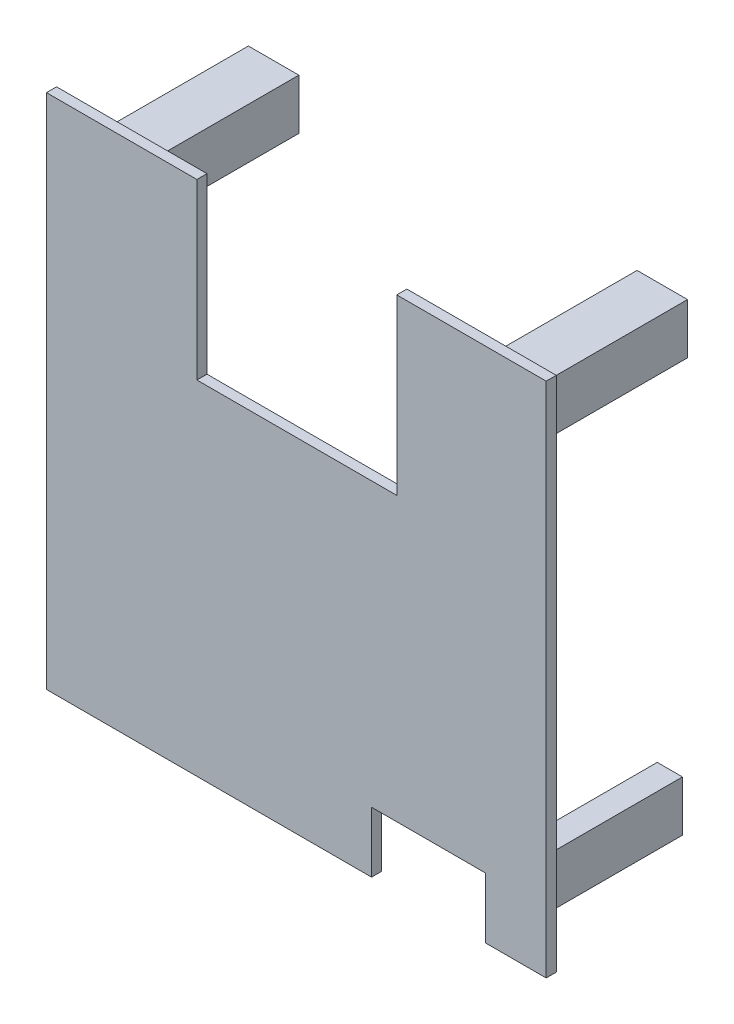
ISO-10303-21;
HEADER;
FILE_DESCRIPTION(('STEP AP214'),'2;1');
FILE_NAME('part.step','',(''),(''),'','','');
FILE_SCHEMA(('AUTOMOTIVE_DESIGN { 1 0 10303 214 1 1 1 1 }'));
ENDSEC;
DATA;
#1=APPLICATION_CONTEXT('core data for automotive mechanical design processes');
#2=APPLICATION_PROTOCOL_DEFINITION('international standard','automotive_design',2000,#1);
#3=PRODUCT_CONTEXT('',#1,'mechanical');
#4=PRODUCT('Part','Part','',(#3));
#5=PRODUCT_RELATED_PRODUCT_CATEGORY('part','',(#4));
#6=PRODUCT_DEFINITION_FORMATION('','',#4);
#7=PRODUCT_DEFINITION_CONTEXT('part definition',#1,'design');
#8=PRODUCT_DEFINITION('design','',#6,#7);
#9=PRODUCT_DEFINITION_SHAPE('','',#8);
#10=(LENGTH_UNIT() NAMED_UNIT(*) SI_UNIT(.MILLI.,.METRE.));
#11=(NAMED_UNIT(*) PLANE_ANGLE_UNIT() SI_UNIT($,.RADIAN.));
#12=(NAMED_UNIT(*) SI_UNIT($,.STERADIAN.) SOLID_ANGLE_UNIT());
#13=UNCERTAINTY_MEASURE_WITH_UNIT(LENGTH_MEASURE(1.E-05),#10,'distance_accuracy_value','');
#14=(GEOMETRIC_REPRESENTATION_CONTEXT(3) GLOBAL_UNCERTAINTY_ASSIGNED_CONTEXT((#13)) GLOBAL_UNIT_ASSIGNED_CONTEXT((#10,
#11,#12)) REPRESENTATION_CONTEXT('',''));
#15=CARTESIAN_POINT('',(0.,0.,0.));
#16=DIRECTION('',(0.,0.,1.));
#17=DIRECTION('',(1.,0.,0.));
#18=AXIS2_PLACEMENT_3D('',#15,#16,#17);
#19=CARTESIAN_POINT('',(0.,0.,0.));
#20=DIRECTION('',(0.,0.,1.));
#21=DIRECTION('',(1.,0.,0.));
#22=AXIS2_PLACEMENT_3D('',#19,#20,#21);
#23=PLANE('',#22);
#24=DIRECTION('',(0.,-1.,0.));
#25=VECTOR('',#24,1.);
#26=CARTESIAN_POINT('',(20.3831367483599,13.5887096774194,0.));
#27=LINE('',#26,#25);
#28=CARTESIAN_POINT('',(20.3831367483599,13.5887096774194,0.));
#29=VERTEX_POINT('',#28);
#30=CARTESIAN_POINT('',(20.3831367483599,8.58870967741935,0.));
#31=VERTEX_POINT('',#30);
#32=EDGE_CURVE('E257',#29,#31,#27,.T.);
#33=ORIENTED_EDGE('',*,*,#32,.F.);
#34=DIRECTION('',(1.,0.,0.));
#35=VECTOR('',#34,1.);
#36=CARTESIAN_POINT('',(20.3831367483599,13.5887096774194,0.));
#37=LINE('',#36,#35);
#38=CARTESIAN_POINT('',(15.3831367483599,13.5887096774194,0.));
#39=VERTEX_POINT('',#38);
#40=EDGE_CURVE('E273',#39,#29,#37,.T.);
#41=ORIENTED_EDGE('',*,*,#40,.F.);
#42=DIRECTION('',(0.,1.,0.));
#43=VECTOR('',#42,1.);
#44=CARTESIAN_POINT('',(15.3831367483599,13.5887096774194,0.));
#45=LINE('',#44,#43);
#46=CARTESIAN_POINT('',(15.3831367483599,8.58870967741935,0.));
#47=VERTEX_POINT('',#46);
#48=EDGE_CURVE('E286',#47,#39,#45,.T.);
#49=ORIENTED_EDGE('',*,*,#48,.F.);
#50=DIRECTION('',(-1.,0.,0.));
#51=VECTOR('',#50,1.);
#52=CARTESIAN_POINT('',(20.3831367483599,8.58870967741935,0.));
#53=LINE('',#52,#51);
#54=EDGE_CURVE('E262',#31,#47,#53,.T.);
#55=ORIENTED_EDGE('',*,*,#54,.F.);
#56=EDGE_LOOP('',(#33,#41,#49,#55));
#57=FACE_BOUND('',#56,.T.);
#58=DIRECTION('',(0.,-1.,0.));
#59=VECTOR('',#58,1.);
#60=CARTESIAN_POINT('',(-18.1168632516401,13.5887096774194,0.));
#61=LINE('',#60,#59);
#62=CARTESIAN_POINT('',(-18.1168632516401,13.5887096774194,0.));
#63=VERTEX_POINT('',#62);
#64=CARTESIAN_POINT('',(-18.1168632516401,8.58870967741935,0.));
#65=VERTEX_POINT('',#64);
#66=EDGE_CURVE('E353',#63,#65,#61,.T.);
#67=ORIENTED_EDGE('',*,*,#66,.F.);
#68=DIRECTION('',(1.,0.,0.));
#69=VECTOR('',#68,1.);
#70=CARTESIAN_POINT('',(-18.1168632516401,13.5887096774194,0.));
#71=LINE('',#70,#69);
#72=CARTESIAN_POINT('',(-23.1168632516401,13.5887096774194,0.));
#73=VERTEX_POINT('',#72);
#74=EDGE_CURVE('E359',#73,#63,#71,.T.);
#75=ORIENTED_EDGE('',*,*,#74,.F.);
#76=DIRECTION('',(0.,1.,0.));
#77=VECTOR('',#76,1.);
#78=CARTESIAN_POINT('',(-23.1168632516401,13.5887096774194,0.));
#79=LINE('',#78,#77);
#80=CARTESIAN_POINT('',(-23.1168632516401,8.58870967741935,0.));
#81=VERTEX_POINT('',#80);
#82=EDGE_CURVE('E376',#81,#73,#79,.T.);
#83=ORIENTED_EDGE('',*,*,#82,.F.);
#84=DIRECTION('',(-1.,0.,0.));
#85=VECTOR('',#84,1.);
#86=CARTESIAN_POINT('',(-18.1168632516401,8.58870967741935,0.));
#87=LINE('',#86,#85);
#88=EDGE_CURVE('E372',#65,#81,#87,.T.);
#89=ORIENTED_EDGE('',*,*,#88,.F.);
#90=EDGE_LOOP('',(#67,#75,#83,#89));
#91=FACE_BOUND('',#90,.T.);
#92=DIRECTION('',(-1.,0.,0.));
#93=VECTOR('',#92,1.);
#94=CARTESIAN_POINT('',(19.8831367483599,-32.6112903225806,0.));
#95=LINE('',#94,#93);
#96=CARTESIAN_POINT('',(19.8831367483599,-32.6112903225806,0.));
#97=VERTEX_POINT('',#96);
#98=CARTESIAN_POINT('',(17.3831367483599,-32.6112903225806,0.));
#99=VERTEX_POINT('',#98);
#100=EDGE_CURVE('E327',#97,#99,#95,.T.);
#101=ORIENTED_EDGE('',*,*,#100,.F.);
#102=DIRECTION('',(0.,-1.,0.));
#103=VECTOR('',#102,1.);
#104=CARTESIAN_POINT('',(19.8831367483599,-27.6112903225806,0.));
#105=LINE('',#104,#103);
#106=CARTESIAN_POINT('',(19.8831367483599,-27.6112903225806,0.));
#107=VERTEX_POINT('',#106);
#108=EDGE_CURVE('E308',#107,#97,#105,.T.);
#109=ORIENTED_EDGE('',*,*,#108,.F.);
#110=DIRECTION('',(1.,0.,0.));
#111=VECTOR('',#110,1.);
#112=CARTESIAN_POINT('',(19.8831367483599,-27.6112903225806,0.));
#113=LINE('',#112,#111);
#114=CARTESIAN_POINT('',(17.3831367483599,-27.6112903225806,0.));
#115=VERTEX_POINT('',#114);
#116=EDGE_CURVE('E314',#115,#107,#113,.T.);
#117=ORIENTED_EDGE('',*,*,#116,.F.);
#118=DIRECTION('',(0.,1.,0.));
#119=VECTOR('',#118,1.);
#120=CARTESIAN_POINT('',(17.3831367483599,-27.6112903225806,0.));
#121=LINE('',#120,#119);
#122=CARTESIAN_POINT('',(17.3831367483599,-28.6112903225806,0.));
#123=VERTEX_POINT('',#122);
#124=EDGE_CURVE('E331',#123,#115,#121,.T.);
#125=ORIENTED_EDGE('',*,*,#124,.F.);
#126=DIRECTION('',(-1.,0.,0.));
#127=VECTOR('',#126,1.);
#128=CARTESIAN_POINT('',(0.,-28.6112903225807,0.));
#129=LINE('',#128,#127);
#130=CARTESIAN_POINT('',(6.0831367483599,-28.6112903225807,0.));
#131=VERTEX_POINT('',#130);
#132=EDGE_CURVE('E496',#123,#131,#129,.T.);
#133=ORIENTED_EDGE('',*,*,#132,.T.);
#134=DIRECTION('',(0.,-1.,0.));
#135=VECTOR('',#134,1.);
#136=CARTESIAN_POINT('',(6.08313674835987,0.,0.));
#137=LINE('',#136,#135);
#138=CARTESIAN_POINT('',(6.08313674835991,-34.6112903225806,0.));
#139=VERTEX_POINT('',#138);
#140=EDGE_CURVE('E500',#131,#139,#137,.T.);
#141=ORIENTED_EDGE('',*,*,#140,.T.);
#142=DIRECTION('',(1.,0.,0.));
#143=VECTOR('',#142,1.);
#144=CARTESIAN_POINT('',(-26.1168632516401,-34.6112903225806,0.));
#145=LINE('',#144,#143);
#146=CARTESIAN_POINT('',(-26.1168632516401,-34.6112903225806,0.));
#147=VERTEX_POINT('',#146);
#148=EDGE_CURVE('E470',#147,#139,#145,.T.);
#149=ORIENTED_EDGE('',*,*,#148,.F.);
#150=DIRECTION('',(0.,-1.,0.));
#151=VECTOR('',#150,1.);
#152=CARTESIAN_POINT('',(-26.1168632516401,16.5887096774194,0.));
#153=LINE('',#152,#151);
#154=CARTESIAN_POINT('',(-26.1168632516401,16.5887096774194,0.));
#155=VERTEX_POINT('',#154);
#156=EDGE_CURVE('E415',#155,#147,#153,.T.);
#157=ORIENTED_EDGE('',*,*,#156,.F.);
#158=DIRECTION('',(-1.,0.,0.));
#159=VECTOR('',#158,1.);
#160=CARTESIAN_POINT('',(-26.1168632516401,16.5887096774194,0.));
#161=LINE('',#160,#159);
#162=CARTESIAN_POINT('',(-11.2168632516401,16.5887096774194,0.));
#163=VERTEX_POINT('',#162);
#164=EDGE_CURVE('E477',#163,#155,#161,.T.);
#165=ORIENTED_EDGE('',*,*,#164,.F.);
#166=DIRECTION('',(0.,-1.,0.));
#167=VECTOR('',#166,1.);
#168=CARTESIAN_POINT('',(-11.2168632516401,0.,0.));
#169=LINE('',#168,#167);
#170=CARTESIAN_POINT('',(-11.2168632516401,-0.611290322580643,0.));
#171=VERTEX_POINT('',#170);
#172=EDGE_CURVE('E11',#163,#171,#169,.T.);
#173=ORIENTED_EDGE('',*,*,#172,.T.);
#174=DIRECTION('',(1.,0.,0.));
#175=VECTOR('',#174,1.);
#176=CARTESIAN_POINT('',(0.,-0.611290322580643,0.));
#177=LINE('',#176,#175);
#178=CARTESIAN_POINT('',(8.58313674835991,-0.611290322580643,0.));
#179=VERTEX_POINT('',#178);
#180=EDGE_CURVE('E507',#171,#179,#177,.T.);
#181=ORIENTED_EDGE('',*,*,#180,.T.);
#182=DIRECTION('',(0.,1.,0.));
#183=VECTOR('',#182,1.);
#184=CARTESIAN_POINT('',(8.58313674835991,0.,0.));
#185=LINE('',#184,#183);
#186=CARTESIAN_POINT('',(8.5831367483599,16.5887096774194,0.));
#187=VERTEX_POINT('',#186);
#188=EDGE_CURVE('E56',#179,#187,#185,.T.);
#189=ORIENTED_EDGE('',*,*,#188,.T.);
#190=CARTESIAN_POINT('',(23.3831367483599,16.5887096774194,0.));
#191=VERTEX_POINT('',#190);
#192=EDGE_CURVE('E452',#191,#187,#161,.T.);
#193=ORIENTED_EDGE('',*,*,#192,.F.);
#194=DIRECTION('',(0.,1.,0.));
#195=VECTOR('',#194,1.);
#196=CARTESIAN_POINT('',(23.3831367483599,16.5887096774194,0.));
#197=LINE('',#196,#195);
#198=CARTESIAN_POINT('',(23.3831367483599,-34.6112903225806,0.));
#199=VERTEX_POINT('',#198);
#200=EDGE_CURVE('E474',#199,#191,#197,.T.);
#201=ORIENTED_EDGE('',*,*,#200,.F.);
#202=CARTESIAN_POINT('',(17.3831367483599,-34.6112903225806,0.));
#203=VERTEX_POINT('',#202);
#204=EDGE_CURVE('E469',#203,#199,#145,.T.);
#205=ORIENTED_EDGE('',*,*,#204,.F.);
#206=DIRECTION('',(0.,1.,0.));
#207=VECTOR('',#206,1.);
#208=CARTESIAN_POINT('',(17.3831367483599,0.,0.));
#209=LINE('',#208,#207);
#210=EDGE_CURVE('E504',#203,#99,#209,.T.);
#211=ORIENTED_EDGE('',*,*,#210,.T.);
#212=EDGE_LOOP('',(#101,#109,#117,#125,#133,#141,#149,#157,#165,#173,#181,#189,#193,#201,#205,#211));
#213=FACE_BOUND('',#212,.T.);
#214=DIRECTION('',(0.,-1.,0.));
#215=VECTOR('',#214,1.);
#216=CARTESIAN_POINT('',(-19.1168632516401,-27.6112903225806,0.));
#217=LINE('',#216,#215);
#218=CARTESIAN_POINT('',(-19.1168632516401,-27.6112903225806,0.));
#219=VERTEX_POINT('',#218);
#220=CARTESIAN_POINT('',(-19.1168632516401,-31.6112903225806,0.));
#221=VERTEX_POINT('',#220);
#222=EDGE_CURVE('E255',#219,#221,#217,.T.);
#223=ORIENTED_EDGE('',*,*,#222,.F.);
#224=DIRECTION('',(1.,0.,0.));
#225=VECTOR('',#224,1.);
#226=CARTESIAN_POINT('',(-19.1168632516401,-27.6112903225806,0.));
#227=LINE('',#226,#225);
#228=CARTESIAN_POINT('',(-23.1168632516401,-27.6112903225806,0.));
#229=VERTEX_POINT('',#228);
#230=EDGE_CURVE('E252',#229,#219,#227,.T.);
#231=ORIENTED_EDGE('',*,*,#230,.F.);
#232=DIRECTION('',(0.,1.,0.));
#233=VECTOR('',#232,1.);
#234=CARTESIAN_POINT('',(-23.1168632516401,-27.6112903225806,0.));
#235=LINE('',#234,#233);
#236=CARTESIAN_POINT('',(-23.1168632516401,-31.6112903225806,0.));
#237=VERTEX_POINT('',#236);
#238=EDGE_CURVE('E68',#237,#229,#235,.T.);
#239=ORIENTED_EDGE('',*,*,#238,.F.);
#240=DIRECTION('',(-1.,0.,0.));
#241=VECTOR('',#240,1.);
#242=CARTESIAN_POINT('',(-19.1168632516401,-31.6112903225806,0.));
#243=LINE('',#242,#241);
#244=EDGE_CURVE('E63',#221,#237,#243,.T.);
#245=ORIENTED_EDGE('',*,*,#244,.F.);
#246=EDGE_LOOP('',(#223,#231,#239,#245));
#247=FACE_BOUND('',#246,.T.);
#248=ADVANCED_FACE('F47',(#57,#91,#213,#247),#23,.F.);
#249=CARTESIAN_POINT('',(-26.1168632516401,-34.6112903225806,1.));
#250=DIRECTION('',(0.,1.,0.));
#251=DIRECTION('',(0.,0.,1.));
#252=AXIS2_PLACEMENT_3D('',#249,#250,#251);
#253=PLANE('',#252);
#254=DIRECTION('',(1.,0.,0.));
#255=VECTOR('',#254,1.);
#256=CARTESIAN_POINT('',(-26.1168632516401,-34.6112903225806,1.));
#257=LINE('',#256,#255);
#258=CARTESIAN_POINT('',(17.3831367483599,-34.6112903225806,1.));
#259=VERTEX_POINT('',#258);
#260=CARTESIAN_POINT('',(23.3831367483599,-34.6112903225806,1.));
#261=VERTEX_POINT('',#260);
#262=EDGE_CURVE('E451',#259,#261,#257,.T.);
#263=ORIENTED_EDGE('',*,*,#262,.F.);
#264=DIRECTION('',(0.,0.,1.));
#265=VECTOR('',#264,1.);
#266=CARTESIAN_POINT('',(17.3831367483599,-34.6112903225806,-4.));
#267=LINE('',#266,#265);
#268=EDGE_CURVE('E398',#203,#259,#267,.T.);
#269=ORIENTED_EDGE('',*,*,#268,.F.);
#270=ORIENTED_EDGE('',*,*,#204,.T.);
#271=DIRECTION('',(0.,0.,-1.));
#272=VECTOR('',#271,1.);
#273=CARTESIAN_POINT('',(23.3831367483599,-34.6112903225806,1.));
#274=LINE('',#273,#272);
#275=EDGE_CURVE('E488',#261,#199,#274,.T.);
#276=ORIENTED_EDGE('',*,*,#275,.F.);
#277=EDGE_LOOP('',(#263,#269,#270,#276));
#278=FACE_BOUND('',#277,.T.);
#279=ADVANCED_FACE('F561',(#278),#253,.F.);
#280=CARTESIAN_POINT('',(-26.1168632516401,16.5887096774194,1.));
#281=DIRECTION('',(0.,-1.,0.));
#282=DIRECTION('',(0.,0.,-1.));
#283=AXIS2_PLACEMENT_3D('',#280,#281,#282);
#284=PLANE('',#283);
#285=DIRECTION('',(-1.,0.,0.));
#286=VECTOR('',#285,1.);
#287=CARTESIAN_POINT('',(-26.1168632516401,16.5887096774194,1.));
#288=LINE('',#287,#286);
#289=CARTESIAN_POINT('',(-11.2168632516401,16.5887096774194,1.));
#290=VERTEX_POINT('',#289);
#291=CARTESIAN_POINT('',(-26.1168632516401,16.5887096774194,1.));
#292=VERTEX_POINT('',#291);
#293=EDGE_CURVE('E460',#290,#292,#288,.T.);
#294=ORIENTED_EDGE('',*,*,#293,.F.);
#295=DIRECTION('',(0.,0.,1.));
#296=VECTOR('',#295,1.);
#297=CARTESIAN_POINT('',(-11.2168632516401,16.5887096774194,-4.));
#298=LINE('',#297,#296);
#299=EDGE_CURVE('E412',#163,#290,#298,.T.);
#300=ORIENTED_EDGE('',*,*,#299,.F.);
#301=ORIENTED_EDGE('',*,*,#164,.T.);
#302=DIRECTION('',(0.,0.,-1.));
#303=VECTOR('',#302,1.);
#304=CARTESIAN_POINT('',(-26.1168632516401,16.5887096774194,1.));
#305=LINE('',#304,#303);
#306=EDGE_CURVE('E465',#292,#155,#305,.T.);
#307=ORIENTED_EDGE('',*,*,#306,.F.);
#308=EDGE_LOOP('',(#294,#300,#301,#307));
#309=FACE_BOUND('',#308,.T.);
#310=ADVANCED_FACE('F542',(#309),#284,.F.);
#311=CARTESIAN_POINT('',(-26.1168632516401,16.5887096774194,1.));
#312=DIRECTION('',(1.,0.,0.));
#313=DIRECTION('',(0.,1.,0.));
#314=AXIS2_PLACEMENT_3D('',#311,#312,#313);
#315=PLANE('',#314);
#316=ORIENTED_EDGE('',*,*,#156,.T.);
#317=DIRECTION('',(0.,0.,-1.));
#318=VECTOR('',#317,1.);
#319=CARTESIAN_POINT('',(-26.1168632516401,-34.6112903225806,1.));
#320=LINE('',#319,#318);
#321=CARTESIAN_POINT('',(-26.1168632516401,-34.6112903225806,1.));
#322=VERTEX_POINT('',#321);
#323=EDGE_CURVE('E492',#322,#147,#320,.T.);
#324=ORIENTED_EDGE('',*,*,#323,.F.);
#325=DIRECTION('',(0.,-1.,0.));
#326=VECTOR('',#325,1.);
#327=CARTESIAN_POINT('',(-26.1168632516401,16.5887096774194,1.));
#328=LINE('',#327,#326);
#329=EDGE_CURVE('E447',#292,#322,#328,.T.);
#330=ORIENTED_EDGE('',*,*,#329,.F.);
#331=ORIENTED_EDGE('',*,*,#306,.T.);
#332=EDGE_LOOP('',(#316,#324,#330,#331));
#333=FACE_BOUND('',#332,.T.);
#334=ADVANCED_FACE('F49',(#333),#315,.F.);
#335=ORIENTED_EDGE('',*,*,#148,.T.);
#336=DIRECTION('',(0.,0.,1.));
#337=VECTOR('',#336,1.);
#338=CARTESIAN_POINT('',(6.08313674835991,-34.6112903225806,-4.));
#339=LINE('',#338,#337);
#340=CARTESIAN_POINT('',(6.08313674835991,-34.6112903225806,1.));
#341=VERTEX_POINT('',#340);
#342=EDGE_CURVE('E432',#139,#341,#339,.T.);
#343=ORIENTED_EDGE('',*,*,#342,.T.);
#344=EDGE_CURVE('E453',#322,#341,#257,.T.);
#345=ORIENTED_EDGE('',*,*,#344,.F.);
#346=ORIENTED_EDGE('',*,*,#323,.T.);
#347=EDGE_LOOP('',(#335,#343,#345,#346));
#348=FACE_BOUND('',#347,.T.);
#349=ADVANCED_FACE('F547',(#348),#253,.F.);
#350=CARTESIAN_POINT('',(23.3831367483599,16.5887096774194,1.));
#351=DIRECTION('',(-1.,0.,0.));
#352=DIRECTION('',(0.,0.,1.));
#353=AXIS2_PLACEMENT_3D('',#350,#351,#352);
#354=PLANE('',#353);
#355=ORIENTED_EDGE('',*,*,#200,.T.);
#356=DIRECTION('',(0.,0.,-1.));
#357=VECTOR('',#356,1.);
#358=CARTESIAN_POINT('',(23.3831367483599,16.5887096774194,1.));
#359=LINE('',#358,#357);
#360=CARTESIAN_POINT('',(23.3831367483599,16.5887096774194,1.));
#361=VERTEX_POINT('',#360);
#362=EDGE_CURVE('E484',#361,#191,#359,.T.);
#363=ORIENTED_EDGE('',*,*,#362,.F.);
#364=DIRECTION('',(0.,1.,0.));
#365=VECTOR('',#364,1.);
#366=CARTESIAN_POINT('',(23.3831367483599,16.5887096774194,1.));
#367=LINE('',#366,#365);
#368=EDGE_CURVE('E457',#261,#361,#367,.T.);
#369=ORIENTED_EDGE('',*,*,#368,.F.);
#370=ORIENTED_EDGE('',*,*,#275,.T.);
#371=EDGE_LOOP('',(#355,#363,#369,#370));
#372=FACE_BOUND('',#371,.T.);
#373=ADVANCED_FACE('F523',(#372),#354,.F.);
#374=ORIENTED_EDGE('',*,*,#192,.T.);
#375=DIRECTION('',(0.,0.,1.));
#376=VECTOR('',#375,1.);
#377=CARTESIAN_POINT('',(8.5831367483599,16.5887096774194,-4.));
#378=LINE('',#377,#376);
#379=CARTESIAN_POINT('',(8.5831367483599,16.5887096774194,1.));
#380=VERTEX_POINT('',#379);
#381=EDGE_CURVE('E416',#187,#380,#378,.T.);
#382=ORIENTED_EDGE('',*,*,#381,.T.);
#383=EDGE_CURVE('E461',#361,#380,#288,.T.);
#384=ORIENTED_EDGE('',*,*,#383,.F.);
#385=ORIENTED_EDGE('',*,*,#362,.T.);
#386=EDGE_LOOP('',(#374,#382,#384,#385));
#387=FACE_BOUND('',#386,.T.);
#388=ADVANCED_FACE('F518',(#387),#284,.F.);
#389=CARTESIAN_POINT('',(0.,0.,1.));
#390=DIRECTION('',(0.,0.,1.));
#391=DIRECTION('',(1.,0.,0.));
#392=AXIS2_PLACEMENT_3D('',#389,#390,#391);
#393=PLANE('',#392);
#394=DIRECTION('',(0.,-1.,0.));
#395=VECTOR('',#394,1.);
#396=CARTESIAN_POINT('',(-11.2168632516401,16.5887096774194,1.));
#397=LINE('',#396,#395);
#398=CARTESIAN_POINT('',(-11.2168632516401,-0.611290322580643,1.));
#399=VERTEX_POINT('',#398);
#400=EDGE_CURVE('E399',#290,#399,#397,.T.);
#401=ORIENTED_EDGE('',*,*,#400,.F.);
#402=ORIENTED_EDGE('',*,*,#293,.T.);
#403=ORIENTED_EDGE('',*,*,#329,.T.);
#404=ORIENTED_EDGE('',*,*,#344,.T.);
#405=DIRECTION('',(0.,-1.,0.));
#406=VECTOR('',#405,1.);
#407=CARTESIAN_POINT('',(6.08313674835991,-34.6112903225806,1.));
#408=LINE('',#407,#406);
#409=CARTESIAN_POINT('',(6.0831367483599,-28.6112903225807,1.));
#410=VERTEX_POINT('',#409);
#411=EDGE_CURVE('E428',#410,#341,#408,.T.);
#412=ORIENTED_EDGE('',*,*,#411,.F.);
#413=DIRECTION('',(-1.,0.,0.));
#414=VECTOR('',#413,1.);
#415=CARTESIAN_POINT('',(17.3831367483599,-28.6112903225806,1.));
#416=LINE('',#415,#414);
#417=CARTESIAN_POINT('',(17.3831367483599,-28.6112903225806,1.));
#418=VERTEX_POINT('',#417);
#419=EDGE_CURVE('E440',#418,#410,#416,.T.);
#420=ORIENTED_EDGE('',*,*,#419,.F.);
#421=DIRECTION('',(0.,1.,0.));
#422=VECTOR('',#421,1.);
#423=CARTESIAN_POINT('',(17.3831367483599,-34.6112903225806,1.));
#424=LINE('',#423,#422);
#425=EDGE_CURVE('E404',#259,#418,#424,.T.);
#426=ORIENTED_EDGE('',*,*,#425,.F.);
#427=ORIENTED_EDGE('',*,*,#262,.T.);
#428=ORIENTED_EDGE('',*,*,#368,.T.);
#429=ORIENTED_EDGE('',*,*,#383,.T.);
#430=DIRECTION('',(0.,1.,0.));
#431=VECTOR('',#430,1.);
#432=CARTESIAN_POINT('',(8.5831367483599,16.5887096774194,1.));
#433=LINE('',#432,#431);
#434=CARTESIAN_POINT('',(8.58313674835991,-0.611290322580643,1.));
#435=VERTEX_POINT('',#434);
#436=EDGE_CURVE('E408',#435,#380,#433,.T.);
#437=ORIENTED_EDGE('',*,*,#436,.F.);
#438=DIRECTION('',(1.,0.,0.));
#439=VECTOR('',#438,1.);
#440=CARTESIAN_POINT('',(-11.2168632516401,-0.611290322580643,1.));
#441=LINE('',#440,#439);
#442=EDGE_CURVE('E403',#399,#435,#441,.T.);
#443=ORIENTED_EDGE('',*,*,#442,.F.);
#444=EDGE_LOOP('',(#401,#402,#403,#404,#412,#420,#426,#427,#428,#429,#437,#443));
#445=FACE_BOUND('',#444,.T.);
#446=ADVANCED_FACE('F536',(#445),#393,.T.);
#447=CARTESIAN_POINT('',(17.3831367483599,-34.6112903225806,-4.));
#448=DIRECTION('',(1.,0.,0.));
#449=DIRECTION('',(0.,0.,-1.));
#450=AXIS2_PLACEMENT_3D('',#447,#448,#449);
#451=PLANE('',#450);
#452=ORIENTED_EDGE('',*,*,#268,.T.);
#453=ORIENTED_EDGE('',*,*,#425,.T.);
#454=DIRECTION('',(0.,0.,1.));
#455=VECTOR('',#454,1.);
#456=CARTESIAN_POINT('',(17.3831367483599,-28.6112903225806,-4.));
#457=LINE('',#456,#455);
#458=EDGE_CURVE('E425',#123,#418,#457,.T.);
#459=ORIENTED_EDGE('',*,*,#458,.F.);
#460=ORIENTED_EDGE('',*,*,#124,.T.);
#461=DIRECTION('',(0.,0.,1.));
#462=VECTOR('',#461,1.);
#463=CARTESIAN_POINT('',(17.3831367483599,-27.6112903225806,-16.));
#464=LINE('',#463,#462);
#465=CARTESIAN_POINT('',(17.3831367483599,-27.6112903225806,-16.));
#466=VERTEX_POINT('',#465);
#467=EDGE_CURVE('E341',#466,#115,#464,.T.);
#468=ORIENTED_EDGE('',*,*,#467,.F.);
#469=DIRECTION('',(0.,1.,0.));
#470=VECTOR('',#469,1.);
#471=CARTESIAN_POINT('',(17.3831367483599,-27.6112903225806,-16.));
#472=LINE('',#471,#470);
#473=CARTESIAN_POINT('',(17.3831367483599,-32.6112903225806,-16.));
#474=VERTEX_POINT('',#473);
#475=EDGE_CURVE('E317',#474,#466,#472,.T.);
#476=ORIENTED_EDGE('',*,*,#475,.F.);
#477=DIRECTION('',(0.,0.,1.));
#478=VECTOR('',#477,1.);
#479=CARTESIAN_POINT('',(17.3831367483599,-32.6112903225806,-16.));
#480=LINE('',#479,#478);
#481=EDGE_CURVE('E345',#474,#99,#480,.T.);
#482=ORIENTED_EDGE('',*,*,#481,.T.);
#483=ORIENTED_EDGE('',*,*,#210,.F.);
#484=EDGE_LOOP('',(#452,#453,#459,#460,#468,#476,#482,#483));
#485=FACE_BOUND('',#484,.T.);
#486=ADVANCED_FACE('F559',(#485),#451,.F.);
#487=CARTESIAN_POINT('',(6.08313674835991,-34.6112903225806,-4.));
#488=DIRECTION('',(-1.,0.,0.));
#489=DIRECTION('',(0.,-1.,0.));
#490=AXIS2_PLACEMENT_3D('',#487,#488,#489);
#491=PLANE('',#490);
#492=DIRECTION('',(0.,0.,1.));
#493=VECTOR('',#492,1.);
#494=CARTESIAN_POINT('',(6.0831367483599,-28.6112903225807,-4.));
#495=LINE('',#494,#493);
#496=EDGE_CURVE('E429',#131,#410,#495,.T.);
#497=ORIENTED_EDGE('',*,*,#496,.T.);
#498=ORIENTED_EDGE('',*,*,#411,.T.);
#499=ORIENTED_EDGE('',*,*,#342,.F.);
#500=ORIENTED_EDGE('',*,*,#140,.F.);
#501=EDGE_LOOP('',(#497,#498,#499,#500));
#502=FACE_BOUND('',#501,.T.);
#503=ADVANCED_FACE('F552',(#502),#491,.F.);
#504=CARTESIAN_POINT('',(17.3831367483599,-28.6112903225806,-4.));
#505=DIRECTION('',(0.,1.,0.));
#506=DIRECTION('',(-1.,0.,0.));
#507=AXIS2_PLACEMENT_3D('',#504,#505,#506);
#508=PLANE('',#507);
#509=ORIENTED_EDGE('',*,*,#458,.T.);
#510=ORIENTED_EDGE('',*,*,#419,.T.);
#511=ORIENTED_EDGE('',*,*,#496,.F.);
#512=ORIENTED_EDGE('',*,*,#132,.F.);
#513=EDGE_LOOP('',(#509,#510,#511,#512));
#514=FACE_BOUND('',#513,.T.);
#515=ADVANCED_FACE('F556',(#514),#508,.F.);
#516=CARTESIAN_POINT('',(-11.2168632516401,16.5887096774194,-4.));
#517=DIRECTION('',(-1.,0.,0.));
#518=DIRECTION('',(0.,-1.,0.));
#519=AXIS2_PLACEMENT_3D('',#516,#517,#518);
#520=PLANE('',#519);
#521=ORIENTED_EDGE('',*,*,#299,.T.);
#522=ORIENTED_EDGE('',*,*,#400,.T.);
#523=DIRECTION('',(0.,0.,1.));
#524=VECTOR('',#523,1.);
#525=CARTESIAN_POINT('',(-11.2168632516401,-0.611290322580643,-4.));
#526=LINE('',#525,#524);
#527=EDGE_CURVE('E411',#171,#399,#526,.T.);
#528=ORIENTED_EDGE('',*,*,#527,.F.);
#529=ORIENTED_EDGE('',*,*,#172,.F.);
#530=EDGE_LOOP('',(#521,#522,#528,#529));
#531=FACE_BOUND('',#530,.T.);
#532=ADVANCED_FACE('F640',(#531),#520,.F.);
#533=CARTESIAN_POINT('',(8.5831367483599,16.5887096774194,-4.));
#534=DIRECTION('',(1.,0.,0.));
#535=DIRECTION('',(0.,1.,0.));
#536=AXIS2_PLACEMENT_3D('',#533,#534,#535);
#537=PLANE('',#536);
#538=DIRECTION('',(0.,0.,1.));
#539=VECTOR('',#538,1.);
#540=CARTESIAN_POINT('',(8.58313674835991,-0.611290322580643,-4.));
#541=LINE('',#540,#539);
#542=EDGE_CURVE('E420',#179,#435,#541,.T.);
#543=ORIENTED_EDGE('',*,*,#542,.T.);
#544=ORIENTED_EDGE('',*,*,#436,.T.);
#545=ORIENTED_EDGE('',*,*,#381,.F.);
#546=ORIENTED_EDGE('',*,*,#188,.F.);
#547=EDGE_LOOP('',(#543,#544,#545,#546));
#548=FACE_BOUND('',#547,.T.);
#549=ADVANCED_FACE('F649',(#548),#537,.F.);
#550=CARTESIAN_POINT('',(-11.2168632516401,-0.611290322580643,-4.));
#551=DIRECTION('',(0.,-1.,0.));
#552=DIRECTION('',(0.,0.,-1.));
#553=AXIS2_PLACEMENT_3D('',#550,#551,#552);
#554=PLANE('',#553);
#555=ORIENTED_EDGE('',*,*,#527,.T.);
#556=ORIENTED_EDGE('',*,*,#442,.T.);
#557=ORIENTED_EDGE('',*,*,#542,.F.);
#558=ORIENTED_EDGE('',*,*,#180,.F.);
#559=EDGE_LOOP('',(#555,#556,#557,#558));
#560=FACE_BOUND('',#559,.T.);
#561=ADVANCED_FACE('F659',(#560),#554,.F.);
#562=CARTESIAN_POINT('',(-18.1168632516401,13.5887096774194,-16.));
#563=DIRECTION('',(-1.,0.,0.));
#564=DIRECTION('',(0.,0.,1.));
#565=AXIS2_PLACEMENT_3D('',#562,#563,#564);
#566=PLANE('',#565);
#567=ORIENTED_EDGE('',*,*,#66,.T.);
#568=DIRECTION('',(0.,0.,1.));
#569=VECTOR('',#568,1.);
#570=CARTESIAN_POINT('',(-18.1168632516401,8.58870967741935,-16.));
#571=LINE('',#570,#569);
#572=CARTESIAN_POINT('',(-18.1168632516401,8.58870967741935,-16.));
#573=VERTEX_POINT('',#572);
#574=EDGE_CURVE('E394',#573,#65,#571,.T.);
#575=ORIENTED_EDGE('',*,*,#574,.F.);
#576=DIRECTION('',(0.,-1.,0.));
#577=VECTOR('',#576,1.);
#578=CARTESIAN_POINT('',(-18.1168632516401,13.5887096774194,-16.));
#579=LINE('',#578,#577);
#580=CARTESIAN_POINT('',(-18.1168632516401,13.5887096774194,-16.));
#581=VERTEX_POINT('',#580);
#582=EDGE_CURVE('E354',#581,#573,#579,.T.);
#583=ORIENTED_EDGE('',*,*,#582,.F.);
#584=DIRECTION('',(0.,0.,1.));
#585=VECTOR('',#584,1.);
#586=CARTESIAN_POINT('',(-18.1168632516401,13.5887096774194,-16.));
#587=LINE('',#586,#585);
#588=EDGE_CURVE('E368',#581,#63,#587,.T.);
#589=ORIENTED_EDGE('',*,*,#588,.T.);
#590=EDGE_LOOP('',(#567,#575,#583,#589));
#591=FACE_BOUND('',#590,.T.);
#592=ADVANCED_FACE('F668',(#591),#566,.F.);
#593=CARTESIAN_POINT('',(-18.1168632516401,8.58870967741935,-16.));
#594=DIRECTION('',(0.,1.,0.));
#595=DIRECTION('',(0.,0.,1.));
#596=AXIS2_PLACEMENT_3D('',#593,#594,#595);
#597=PLANE('',#596);
#598=ORIENTED_EDGE('',*,*,#88,.T.);
#599=DIRECTION('',(0.,0.,1.));
#600=VECTOR('',#599,1.);
#601=CARTESIAN_POINT('',(-23.1168632516401,8.58870967741935,-16.));
#602=LINE('',#601,#600);
#603=CARTESIAN_POINT('',(-23.1168632516401,8.58870967741935,-16.));
#604=VERTEX_POINT('',#603);
#605=EDGE_CURVE('E390',#604,#81,#602,.T.);
#606=ORIENTED_EDGE('',*,*,#605,.F.);
#607=DIRECTION('',(-1.,0.,0.));
#608=VECTOR('',#607,1.);
#609=CARTESIAN_POINT('',(-18.1168632516401,8.58870967741935,-16.));
#610=LINE('',#609,#608);
#611=EDGE_CURVE('E358',#573,#604,#610,.T.);
#612=ORIENTED_EDGE('',*,*,#611,.F.);
#613=ORIENTED_EDGE('',*,*,#574,.T.);
#614=EDGE_LOOP('',(#598,#606,#612,#613));
#615=FACE_BOUND('',#614,.T.);
#616=ADVANCED_FACE('F678',(#615),#597,.F.);
#617=CARTESIAN_POINT('',(-23.1168632516401,13.5887096774194,-16.));
#618=DIRECTION('',(1.,0.,0.));
#619=DIRECTION('',(0.,0.,-1.));
#620=AXIS2_PLACEMENT_3D('',#617,#618,#619);
#621=PLANE('',#620);
#622=ORIENTED_EDGE('',*,*,#82,.T.);
#623=DIRECTION('',(0.,0.,1.));
#624=VECTOR('',#623,1.);
#625=CARTESIAN_POINT('',(-23.1168632516401,13.5887096774194,-16.));
#626=LINE('',#625,#624);
#627=CARTESIAN_POINT('',(-23.1168632516401,13.5887096774194,-16.));
#628=VERTEX_POINT('',#627);
#629=EDGE_CURVE('E386',#628,#73,#626,.T.);
#630=ORIENTED_EDGE('',*,*,#629,.F.);
#631=DIRECTION('',(0.,1.,0.));
#632=VECTOR('',#631,1.);
#633=CARTESIAN_POINT('',(-23.1168632516401,13.5887096774194,-16.));
#634=LINE('',#633,#632);
#635=EDGE_CURVE('E362',#604,#628,#634,.T.);
#636=ORIENTED_EDGE('',*,*,#635,.F.);
#637=ORIENTED_EDGE('',*,*,#605,.T.);
#638=EDGE_LOOP('',(#622,#630,#636,#637));
#639=FACE_BOUND('',#638,.T.);
#640=ADVANCED_FACE('F688',(#639),#621,.F.);
#641=CARTESIAN_POINT('',(-18.1168632516401,13.5887096774194,-16.));
#642=DIRECTION('',(0.,-1.,0.));
#643=DIRECTION('',(0.,0.,-1.));
#644=AXIS2_PLACEMENT_3D('',#641,#642,#643);
#645=PLANE('',#644);
#646=ORIENTED_EDGE('',*,*,#74,.T.);
#647=ORIENTED_EDGE('',*,*,#588,.F.);
#648=DIRECTION('',(1.,0.,0.));
#649=VECTOR('',#648,1.);
#650=CARTESIAN_POINT('',(-18.1168632516401,13.5887096774194,-16.));
#651=LINE('',#650,#649);
#652=EDGE_CURVE('E365',#628,#581,#651,.T.);
#653=ORIENTED_EDGE('',*,*,#652,.F.);
#654=ORIENTED_EDGE('',*,*,#629,.T.);
#655=EDGE_LOOP('',(#646,#647,#653,#654));
#656=FACE_BOUND('',#655,.T.);
#657=ADVANCED_FACE('F698',(#656),#645,.F.);
#658=CARTESIAN_POINT('',(0.,0.,-16.));
#659=DIRECTION('',(0.,0.,-1.));
#660=DIRECTION('',(-1.,0.,0.));
#661=AXIS2_PLACEMENT_3D('',#658,#659,#660);
#662=PLANE('',#661);
#663=ORIENTED_EDGE('',*,*,#582,.T.);
#664=ORIENTED_EDGE('',*,*,#611,.T.);
#665=ORIENTED_EDGE('',*,*,#635,.T.);
#666=ORIENTED_EDGE('',*,*,#652,.T.);
#667=EDGE_LOOP('',(#663,#664,#665,#666));
#668=FACE_BOUND('',#667,.T.);
#669=ADVANCED_FACE('F707',(#668),#662,.T.);
#670=CARTESIAN_POINT('',(19.8831367483599,-27.6112903225806,-16.));
#671=DIRECTION('',(-1.,0.,0.));
#672=DIRECTION('',(0.,0.,1.));
#673=AXIS2_PLACEMENT_3D('',#670,#671,#672);
#674=PLANE('',#673);
#675=ORIENTED_EDGE('',*,*,#108,.T.);
#676=DIRECTION('',(0.,0.,1.));
#677=VECTOR('',#676,1.);
#678=CARTESIAN_POINT('',(19.8831367483599,-32.6112903225806,-16.));
#679=LINE('',#678,#677);
#680=CARTESIAN_POINT('',(19.8831367483599,-32.6112903225806,-16.));
#681=VERTEX_POINT('',#680);
#682=EDGE_CURVE('E349',#681,#97,#679,.T.);
#683=ORIENTED_EDGE('',*,*,#682,.F.);
#684=DIRECTION('',(0.,-1.,0.));
#685=VECTOR('',#684,1.);
#686=CARTESIAN_POINT('',(19.8831367483599,-27.6112903225806,-16.));
#687=LINE('',#686,#685);
#688=CARTESIAN_POINT('',(19.8831367483599,-27.6112903225806,-16.));
#689=VERTEX_POINT('',#688);
#690=EDGE_CURVE('E309',#689,#681,#687,.T.);
#691=ORIENTED_EDGE('',*,*,#690,.F.);
#692=DIRECTION('',(0.,0.,1.));
#693=VECTOR('',#692,1.);
#694=CARTESIAN_POINT('',(19.8831367483599,-27.6112903225806,-16.));
#695=LINE('',#694,#693);
#696=EDGE_CURVE('E323',#689,#107,#695,.T.);
#697=ORIENTED_EDGE('',*,*,#696,.T.);
#698=EDGE_LOOP('',(#675,#683,#691,#697));
#699=FACE_BOUND('',#698,.T.);
#700=ADVANCED_FACE('F716',(#699),#674,.F.);
#701=CARTESIAN_POINT('',(19.8831367483599,-32.6112903225806,-16.));
#702=DIRECTION('',(0.,1.,0.));
#703=DIRECTION('',(0.,0.,1.));
#704=AXIS2_PLACEMENT_3D('',#701,#702,#703);
#705=PLANE('',#704);
#706=ORIENTED_EDGE('',*,*,#100,.T.);
#707=ORIENTED_EDGE('',*,*,#481,.F.);
#708=DIRECTION('',(-1.,0.,0.));
#709=VECTOR('',#708,1.);
#710=CARTESIAN_POINT('',(19.8831367483599,-32.6112903225806,-16.));
#711=LINE('',#710,#709);
#712=EDGE_CURVE('E313',#681,#474,#711,.T.);
#713=ORIENTED_EDGE('',*,*,#712,.F.);
#714=ORIENTED_EDGE('',*,*,#682,.T.);
#715=EDGE_LOOP('',(#706,#707,#713,#714));
#716=FACE_BOUND('',#715,.T.);
#717=ADVANCED_FACE('F726',(#716),#705,.F.);
#718=CARTESIAN_POINT('',(19.8831367483599,-27.6112903225806,-16.));
#719=DIRECTION('',(0.,-1.,0.));
#720=DIRECTION('',(0.,0.,-1.));
#721=AXIS2_PLACEMENT_3D('',#718,#719,#720);
#722=PLANE('',#721);
#723=ORIENTED_EDGE('',*,*,#116,.T.);
#724=ORIENTED_EDGE('',*,*,#696,.F.);
#725=DIRECTION('',(1.,0.,0.));
#726=VECTOR('',#725,1.);
#727=CARTESIAN_POINT('',(19.8831367483599,-27.6112903225806,-16.));
#728=LINE('',#727,#726);
#729=EDGE_CURVE('E320',#466,#689,#728,.T.);
#730=ORIENTED_EDGE('',*,*,#729,.F.);
#731=ORIENTED_EDGE('',*,*,#467,.T.);
#732=EDGE_LOOP('',(#723,#724,#730,#731));
#733=FACE_BOUND('',#732,.T.);
#734=ADVANCED_FACE('F734',(#733),#722,.F.);
#735=CARTESIAN_POINT('',(0.,0.,-16.));
#736=DIRECTION('',(0.,0.,-1.));
#737=DIRECTION('',(-1.,0.,0.));
#738=AXIS2_PLACEMENT_3D('',#735,#736,#737);
#739=PLANE('',#738);
#740=ORIENTED_EDGE('',*,*,#690,.T.);
#741=ORIENTED_EDGE('',*,*,#712,.T.);
#742=ORIENTED_EDGE('',*,*,#475,.T.);
#743=ORIENTED_EDGE('',*,*,#729,.T.);
#744=EDGE_LOOP('',(#740,#741,#742,#743));
#745=FACE_BOUND('',#744,.T.);
#746=ADVANCED_FACE('F743',(#745),#739,.T.);
#747=CARTESIAN_POINT('',(20.3831367483599,13.5887096774194,-16.));
#748=DIRECTION('',(-1.,0.,0.));
#749=DIRECTION('',(0.,-1.,0.));
#750=AXIS2_PLACEMENT_3D('',#747,#748,#749);
#751=PLANE('',#750);
#752=ORIENTED_EDGE('',*,*,#32,.T.);
#753=DIRECTION('',(0.,0.,1.));
#754=VECTOR('',#753,1.);
#755=CARTESIAN_POINT('',(20.3831367483599,8.58870967741935,-16.));
#756=LINE('',#755,#754);
#757=CARTESIAN_POINT('',(20.3831367483599,8.58870967741935,-16.));
#758=VERTEX_POINT('',#757);
#759=EDGE_CURVE('E304',#758,#31,#756,.T.);
#760=ORIENTED_EDGE('',*,*,#759,.F.);
#761=DIRECTION('',(0.,-1.,0.));
#762=VECTOR('',#761,1.);
#763=CARTESIAN_POINT('',(20.3831367483599,13.5887096774194,-16.));
#764=LINE('',#763,#762);
#765=CARTESIAN_POINT('',(20.3831367483599,13.5887096774194,-16.));
#766=VERTEX_POINT('',#765);
#767=EDGE_CURVE('E268',#766,#758,#764,.T.);
#768=ORIENTED_EDGE('',*,*,#767,.F.);
#769=DIRECTION('',(0.,0.,1.));
#770=VECTOR('',#769,1.);
#771=CARTESIAN_POINT('',(20.3831367483599,13.5887096774194,-16.));
#772=LINE('',#771,#770);
#773=EDGE_CURVE('E281',#766,#29,#772,.T.);
#774=ORIENTED_EDGE('',*,*,#773,.T.);
#775=EDGE_LOOP('',(#752,#760,#768,#774));
#776=FACE_BOUND('',#775,.T.);
#777=ADVANCED_FACE('F752',(#776),#751,.F.);
#778=CARTESIAN_POINT('',(20.3831367483599,8.58870967741935,-16.));
#779=DIRECTION('',(0.,1.,0.));
#780=DIRECTION('',(0.,0.,1.));
#781=AXIS2_PLACEMENT_3D('',#778,#779,#780);
#782=PLANE('',#781);
#783=ORIENTED_EDGE('',*,*,#54,.T.);
#784=DIRECTION('',(0.,0.,1.));
#785=VECTOR('',#784,1.);
#786=CARTESIAN_POINT('',(15.3831367483599,8.58870967741935,-16.));
#787=LINE('',#786,#785);
#788=CARTESIAN_POINT('',(15.3831367483599,8.58870967741935,-16.));
#789=VERTEX_POINT('',#788);
#790=EDGE_CURVE('E300',#789,#47,#787,.T.);
#791=ORIENTED_EDGE('',*,*,#790,.F.);
#792=DIRECTION('',(-1.,0.,0.));
#793=VECTOR('',#792,1.);
#794=CARTESIAN_POINT('',(20.3831367483599,8.58870967741935,-16.));
#795=LINE('',#794,#793);
#796=EDGE_CURVE('E272',#758,#789,#795,.T.);
#797=ORIENTED_EDGE('',*,*,#796,.F.);
#798=ORIENTED_EDGE('',*,*,#759,.T.);
#799=EDGE_LOOP('',(#783,#791,#797,#798));
#800=FACE_BOUND('',#799,.T.);
#801=ADVANCED_FACE('F761',(#800),#782,.F.);
#802=CARTESIAN_POINT('',(15.3831367483599,13.5887096774194,-16.));
#803=DIRECTION('',(1.,0.,0.));
#804=DIRECTION('',(0.,0.,-1.));
#805=AXIS2_PLACEMENT_3D('',#802,#803,#804);
#806=PLANE('',#805);
#807=ORIENTED_EDGE('',*,*,#48,.T.);
#808=DIRECTION('',(0.,0.,1.));
#809=VECTOR('',#808,1.);
#810=CARTESIAN_POINT('',(15.3831367483599,13.5887096774194,-16.));
#811=LINE('',#810,#809);
#812=CARTESIAN_POINT('',(15.3831367483599,13.5887096774194,-16.));
#813=VERTEX_POINT('',#812);
#814=EDGE_CURVE('E296',#813,#39,#811,.T.);
#815=ORIENTED_EDGE('',*,*,#814,.F.);
#816=DIRECTION('',(0.,1.,0.));
#817=VECTOR('',#816,1.);
#818=CARTESIAN_POINT('',(15.3831367483599,13.5887096774194,-16.));
#819=LINE('',#818,#817);
#820=EDGE_CURVE('E276',#789,#813,#819,.T.);
#821=ORIENTED_EDGE('',*,*,#820,.F.);
#822=ORIENTED_EDGE('',*,*,#790,.T.);
#823=EDGE_LOOP('',(#807,#815,#821,#822));
#824=FACE_BOUND('',#823,.T.);
#825=ADVANCED_FACE('F770',(#824),#806,.F.);
#826=CARTESIAN_POINT('',(20.3831367483599,13.5887096774194,-16.));
#827=DIRECTION('',(0.,-1.,0.));
#828=DIRECTION('',(1.,0.,0.));
#829=AXIS2_PLACEMENT_3D('',#826,#827,#828);
#830=PLANE('',#829);
#831=ORIENTED_EDGE('',*,*,#40,.T.);
#832=ORIENTED_EDGE('',*,*,#773,.F.);
#833=DIRECTION('',(1.,0.,0.));
#834=VECTOR('',#833,1.);
#835=CARTESIAN_POINT('',(20.3831367483599,13.5887096774194,-16.));
#836=LINE('',#835,#834);
#837=EDGE_CURVE('E279',#813,#766,#836,.T.);
#838=ORIENTED_EDGE('',*,*,#837,.F.);
#839=ORIENTED_EDGE('',*,*,#814,.T.);
#840=EDGE_LOOP('',(#831,#832,#838,#839));
#841=FACE_BOUND('',#840,.T.);
#842=ADVANCED_FACE('F779',(#841),#830,.F.);
#843=CARTESIAN_POINT('',(0.,0.,-16.));
#844=DIRECTION('',(0.,0.,-1.));
#845=DIRECTION('',(-1.,0.,0.));
#846=AXIS2_PLACEMENT_3D('',#843,#844,#845);
#847=PLANE('',#846);
#848=ORIENTED_EDGE('',*,*,#767,.T.);
#849=ORIENTED_EDGE('',*,*,#796,.T.);
#850=ORIENTED_EDGE('',*,*,#820,.T.);
#851=ORIENTED_EDGE('',*,*,#837,.T.);
#852=EDGE_LOOP('',(#848,#849,#850,#851));
#853=FACE_BOUND('',#852,.T.);
#854=ADVANCED_FACE('F788',(#853),#847,.T.);
#855=CARTESIAN_POINT('',(-19.1168632516401,-27.6112903225806,-16.));
#856=DIRECTION('',(-1.,0.,0.));
#857=DIRECTION('',(0.,0.,1.));
#858=AXIS2_PLACEMENT_3D('',#855,#856,#857);
#859=PLANE('',#858);
#860=ORIENTED_EDGE('',*,*,#222,.T.);
#861=DIRECTION('',(0.,0.,1.));
#862=VECTOR('',#861,1.);
#863=CARTESIAN_POINT('',(-19.1168632516401,-31.6112903225806,-16.));
#864=LINE('',#863,#862);
#865=CARTESIAN_POINT('',(-19.1168632516401,-31.6112903225806,-16.));
#866=VERTEX_POINT('',#865);
#867=EDGE_CURVE('E234',#866,#221,#864,.T.);
#868=ORIENTED_EDGE('',*,*,#867,.F.);
#869=DIRECTION('',(0.,-1.,0.));
#870=VECTOR('',#869,1.);
#871=CARTESIAN_POINT('',(-19.1168632516401,-27.6112903225806,-16.));
#872=LINE('',#871,#870);
#873=CARTESIAN_POINT('',(-19.1168632516401,-27.6112903225806,-16.));
#874=VERTEX_POINT('',#873);
#875=EDGE_CURVE('E242',#874,#866,#872,.T.);
#876=ORIENTED_EDGE('',*,*,#875,.F.);
#877=DIRECTION('',(0.,0.,1.));
#878=VECTOR('',#877,1.);
#879=CARTESIAN_POINT('',(-19.1168632516401,-27.6112903225806,-16.));
#880=LINE('',#879,#878);
#881=EDGE_CURVE('E862',#874,#219,#880,.T.);
#882=ORIENTED_EDGE('',*,*,#881,.T.);
#883=EDGE_LOOP('',(#860,#868,#876,#882));
#884=FACE_BOUND('',#883,.T.);
#885=ADVANCED_FACE('F254',(#884),#859,.F.);
#886=CARTESIAN_POINT('',(-19.1168632516401,-31.6112903225806,-16.));
#887=DIRECTION('',(0.,1.,0.));
#888=DIRECTION('',(0.,0.,1.));
#889=AXIS2_PLACEMENT_3D('',#886,#887,#888);
#890=PLANE('',#889);
#891=ORIENTED_EDGE('',*,*,#244,.T.);
#892=DIRECTION('',(0.,0.,1.));
#893=VECTOR('',#892,1.);
#894=CARTESIAN_POINT('',(-23.1168632516401,-31.6112903225806,-16.));
#895=LINE('',#894,#893);
#896=CARTESIAN_POINT('',(-23.1168632516401,-31.6112903225806,-16.));
#897=VERTEX_POINT('',#896);
#898=EDGE_CURVE('E237',#897,#237,#895,.T.);
#899=ORIENTED_EDGE('',*,*,#898,.F.);
#900=DIRECTION('',(-1.,0.,0.));
#901=VECTOR('',#900,1.);
#902=CARTESIAN_POINT('',(-19.1168632516401,-31.6112903225806,-16.));
#903=LINE('',#902,#901);
#904=EDGE_CURVE('E230',#866,#897,#903,.T.);
#905=ORIENTED_EDGE('',*,*,#904,.F.);
#906=ORIENTED_EDGE('',*,*,#867,.T.);
#907=EDGE_LOOP('',(#891,#899,#905,#906));
#908=FACE_BOUND('',#907,.T.);
#909=ADVANCED_FACE('F232',(#908),#890,.F.);
#910=CARTESIAN_POINT('',(-23.1168632516401,-27.6112903225806,-16.));
#911=DIRECTION('',(1.,0.,0.));
#912=DIRECTION('',(0.,0.,-1.));
#913=AXIS2_PLACEMENT_3D('',#910,#911,#912);
#914=PLANE('',#913);
#915=ORIENTED_EDGE('',*,*,#238,.T.);
#916=DIRECTION('',(0.,0.,1.));
#917=VECTOR('',#916,1.);
#918=CARTESIAN_POINT('',(-23.1168632516401,-27.6112903225806,-16.));
#919=LINE('',#918,#917);
#920=CARTESIAN_POINT('',(-23.1168632516401,-27.6112903225806,-16.));
#921=VERTEX_POINT('',#920);
#922=EDGE_CURVE('E264',#921,#229,#919,.T.);
#923=ORIENTED_EDGE('',*,*,#922,.F.);
#924=DIRECTION('',(0.,1.,0.));
#925=VECTOR('',#924,1.);
#926=CARTESIAN_POINT('',(-23.1168632516401,-27.6112903225806,-16.));
#927=LINE('',#926,#925);
#928=EDGE_CURVE('E241',#897,#921,#927,.T.);
#929=ORIENTED_EDGE('',*,*,#928,.F.);
#930=ORIENTED_EDGE('',*,*,#898,.T.);
#931=EDGE_LOOP('',(#915,#923,#929,#930));
#932=FACE_BOUND('',#931,.T.);
#933=ADVANCED_FACE('F817',(#932),#914,.F.);
#934=CARTESIAN_POINT('',(-19.1168632516401,-27.6112903225806,-16.));
#935=DIRECTION('',(0.,-1.,0.));
#936=DIRECTION('',(0.,0.,-1.));
#937=AXIS2_PLACEMENT_3D('',#934,#935,#936);
#938=PLANE('',#937);
#939=ORIENTED_EDGE('',*,*,#230,.T.);
#940=ORIENTED_EDGE('',*,*,#881,.F.);
#941=DIRECTION('',(1.,0.,0.));
#942=VECTOR('',#941,1.);
#943=CARTESIAN_POINT('',(-19.1168632516401,-27.6112903225806,-16.));
#944=LINE('',#943,#942);
#945=EDGE_CURVE('E247',#921,#874,#944,.T.);
#946=ORIENTED_EDGE('',*,*,#945,.F.);
#947=ORIENTED_EDGE('',*,*,#922,.T.);
#948=EDGE_LOOP('',(#939,#940,#946,#947));
#949=FACE_BOUND('',#948,.T.);
#950=ADVANCED_FACE('F825',(#949),#938,.F.);
#951=CARTESIAN_POINT('',(0.,0.,-16.));
#952=DIRECTION('',(0.,0.,-1.));
#953=DIRECTION('',(-1.,0.,0.));
#954=AXIS2_PLACEMENT_3D('',#951,#952,#953);
#955=PLANE('',#954);
#956=ORIENTED_EDGE('',*,*,#875,.T.);
#957=ORIENTED_EDGE('',*,*,#904,.T.);
#958=ORIENTED_EDGE('',*,*,#928,.T.);
#959=ORIENTED_EDGE('',*,*,#945,.T.);
#960=EDGE_LOOP('',(#956,#957,#958,#959));
#961=FACE_BOUND('',#960,.T.);
#962=ADVANCED_FACE('F245',(#961),#955,.T.);
#963=CLOSED_SHELL('',(#248,#279,#310,#334,#349,#373,#388,#446,#486,#503,#515,#532,#549,#561,
#592,#616,#640,#657,#669,#700,#717,#734,#746,#777,#801,#825,#842,#854,#885,#909,#933,#950,#962));
#964=MANIFOLD_SOLID_BREP('B2',#963);
#965=ADVANCED_BREP_SHAPE_REPRESENTATION('',(#18,#964),#14);
#966=SHAPE_DEFINITION_REPRESENTATION(#9,#965);
ENDSEC;
END-ISO-10303-21;
